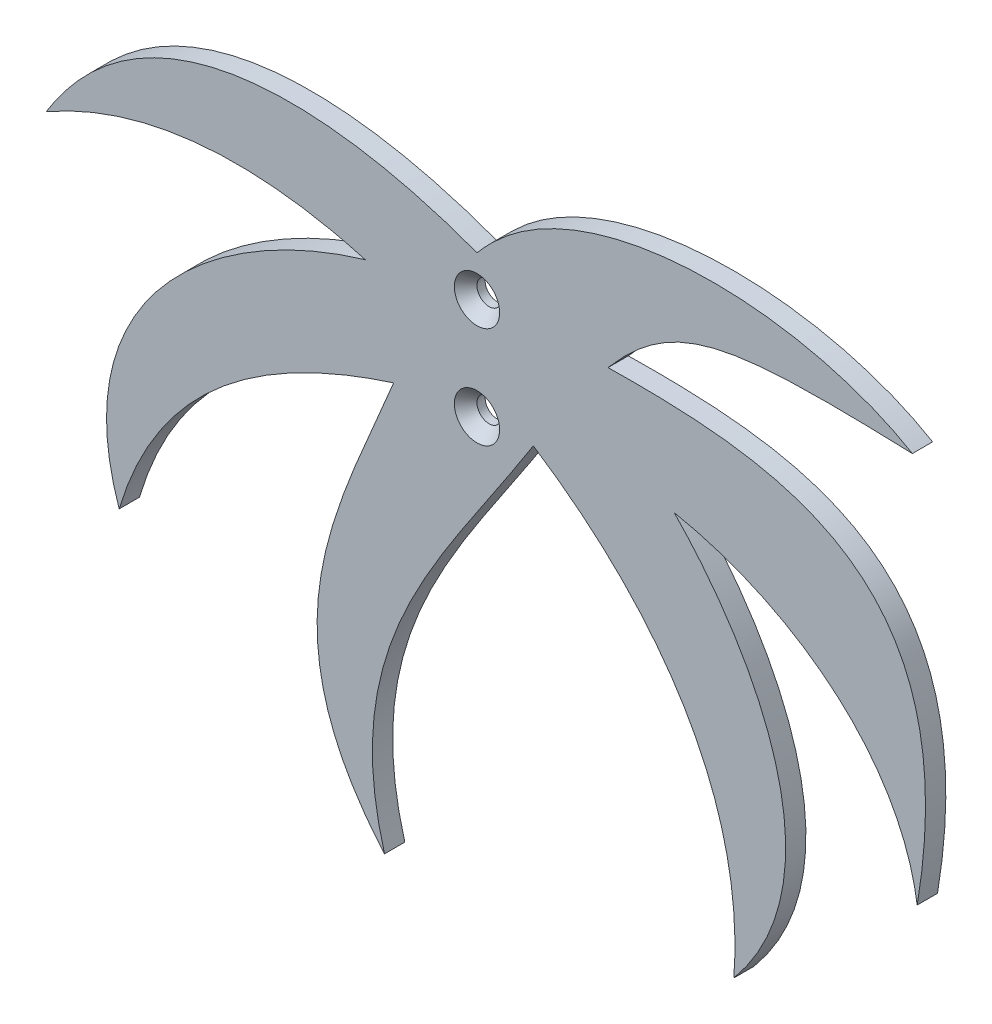
ISO-10303-21;
HEADER;
FILE_DESCRIPTION(('STEP AP214'),'2;1');
FILE_NAME('part.step','',(''),(''),'','','');
FILE_SCHEMA(('AUTOMOTIVE_DESIGN { 1 0 10303 214 1 1 1 1 }'));
ENDSEC;
DATA;
#1=APPLICATION_CONTEXT('core data for automotive mechanical design processes');
#2=APPLICATION_PROTOCOL_DEFINITION('international standard','automotive_design',2000,#1);
#3=PRODUCT_CONTEXT('',#1,'mechanical');
#4=PRODUCT('Part','Part','',(#3));
#5=PRODUCT_RELATED_PRODUCT_CATEGORY('part','',(#4));
#6=PRODUCT_DEFINITION_FORMATION('','',#4);
#7=PRODUCT_DEFINITION_CONTEXT('part definition',#1,'design');
#8=PRODUCT_DEFINITION('design','',#6,#7);
#9=PRODUCT_DEFINITION_SHAPE('','',#8);
#10=(LENGTH_UNIT() NAMED_UNIT(*) SI_UNIT(.MILLI.,.METRE.));
#11=(NAMED_UNIT(*) PLANE_ANGLE_UNIT() SI_UNIT($,.RADIAN.));
#12=(NAMED_UNIT(*) SI_UNIT($,.STERADIAN.) SOLID_ANGLE_UNIT());
#13=UNCERTAINTY_MEASURE_WITH_UNIT(LENGTH_MEASURE(1.E-05),#10,'distance_accuracy_value','');
#14=(GEOMETRIC_REPRESENTATION_CONTEXT(3) GLOBAL_UNCERTAINTY_ASSIGNED_CONTEXT((#13)) GLOBAL_UNIT_ASSIGNED_CONTEXT((#10,
#11,#12)) REPRESENTATION_CONTEXT('',''));
#15=CARTESIAN_POINT('',(0.,0.,0.));
#16=DIRECTION('',(0.,0.,1.));
#17=DIRECTION('',(1.,0.,0.));
#18=AXIS2_PLACEMENT_3D('',#15,#16,#17);
#19=CARTESIAN_POINT('',(34.9318842944097,165.025383651975,3.175));
#20=CARTESIAN_POINT('',(50.935408962238,174.180938827234,3.175));
#21=CARTESIAN_POINT('',(68.3799734184894,174.627254848897,3.175));
#22=CARTESIAN_POINT('',(84.8831580295017,169.92816000068,3.175));
#23=B_SPLINE_CURVE_WITH_KNOTS('',3,(#19,#20,#21,#22),.UNSPECIFIED.,.F.,.F.,(4,4),(0.,
0.348652947278012),.UNSPECIFIED.);
#24=DIRECTION('',(0.,0.,-1.));
#25=VECTOR('',#24,1.);
#26=SURFACE_OF_LINEAR_EXTRUSION('',#23,#25);
#27=CARTESIAN_POINT('',(34.9318842944097,165.025383651975,0.));
#28=CARTESIAN_POINT('',(50.935408962238,174.180938827234,0.));
#29=CARTESIAN_POINT('',(68.3799734184894,174.627254848897,0.));
#30=CARTESIAN_POINT('',(84.8831580295017,169.92816000068,0.));
#31=B_SPLINE_CURVE_WITH_KNOTS('',3,(#27,#28,#29,#30),.UNSPECIFIED.,.F.,.F.,(4,4),(0.,
0.348652947278012),.UNSPECIFIED.);
#32=CARTESIAN_POINT('',(34.9318842944097,165.025383651975,0.));
#33=VERTEX_POINT('',#32);
#34=CARTESIAN_POINT('',(84.8831580295017,169.92816000068,0.));
#35=VERTEX_POINT('',#34);
#36=EDGE_CURVE('E267',#33,#35,#31,.T.);
#37=ORIENTED_EDGE('',*,*,#36,.T.);
#38=DIRECTION('',(0.,0.,-1.));
#39=VECTOR('',#38,1.);
#40=CARTESIAN_POINT('',(84.8831580295017,169.92816000068,3.175));
#41=LINE('',#40,#39);
#42=CARTESIAN_POINT('',(84.8831580295017,169.92816000068,3.175));
#43=VERTEX_POINT('',#42);
#44=EDGE_CURVE('E11',#43,#35,#41,.T.);
#45=ORIENTED_EDGE('',*,*,#44,.F.);
#46=CARTESIAN_POINT('',(34.9318842944097,165.025383651975,3.175));
#47=VERTEX_POINT('',#46);
#48=EDGE_CURVE('E341',#47,#43,#23,.T.);
#49=ORIENTED_EDGE('',*,*,#48,.F.);
#50=DIRECTION('',(0.,0.,-1.));
#51=VECTOR('',#50,1.);
#52=CARTESIAN_POINT('',(34.9318842944097,165.025383651975,3.175));
#53=LINE('',#52,#51);
#54=EDGE_CURVE('E150',#47,#33,#53,.T.);
#55=ORIENTED_EDGE('',*,*,#54,.T.);
#56=EDGE_LOOP('',(#37,#45,#49,#55));
#57=FACE_BOUND('',#56,.T.);
#58=ADVANCED_FACE('F33',(#57),#26,.F.);
#59=CARTESIAN_POINT('',(84.8831580295017,169.92816000068,3.175));
#60=CARTESIAN_POINT('',(82.9281481681476,169.350328203553,3.175));
#61=CARTESIAN_POINT('',(59.9185762656003,161.597817566055,3.175));
#62=CARTESIAN_POINT('',(37.8919334479338,141.396576530359,3.175));
#63=CARTESIAN_POINT('',(46.3484138217359,116.890021040357,3.175));
#64=B_SPLINE_CURVE_WITH_KNOTS('',3,(#59,#60,#61,#62,#63),.UNSPECIFIED.,.F.,.F.,(4,1,4),(0.,
0.0322278870888439,0.380913319405428),.UNSPECIFIED.);
#65=DIRECTION('',(0.,0.,-1.));
#66=VECTOR('',#65,1.);
#67=SURFACE_OF_LINEAR_EXTRUSION('',#64,#66);
#68=CARTESIAN_POINT('',(84.8831580295017,169.92816000068,0.));
#69=CARTESIAN_POINT('',(82.9281481681476,169.350328203553,0.));
#70=CARTESIAN_POINT('',(59.9185762656003,161.597817566055,0.));
#71=CARTESIAN_POINT('',(37.8919334479338,141.396576530359,0.));
#72=CARTESIAN_POINT('',(46.3484138217359,116.890021040357,0.));
#73=B_SPLINE_CURVE_WITH_KNOTS('',3,(#68,#69,#70,#71,#72),.UNSPECIFIED.,.F.,.F.,(4,1,4),(0.,
0.0322278870888439,0.380913319405428),.UNSPECIFIED.);
#74=CARTESIAN_POINT('',(46.3484138217359,116.890021040357,0.));
#75=VERTEX_POINT('',#74);
#76=EDGE_CURVE('E258',#35,#75,#73,.T.);
#77=ORIENTED_EDGE('',*,*,#76,.T.);
#78=DIRECTION('',(0.,0.,-1.));
#79=VECTOR('',#78,1.);
#80=CARTESIAN_POINT('',(46.3484138217359,116.890021040357,3.175));
#81=LINE('',#80,#79);
#82=CARTESIAN_POINT('',(46.3484138217359,116.890021040357,3.175));
#83=VERTEX_POINT('',#82);
#84=EDGE_CURVE('E42',#83,#75,#81,.T.);
#85=ORIENTED_EDGE('',*,*,#84,.F.);
#86=EDGE_CURVE('E105',#43,#83,#64,.T.);
#87=ORIENTED_EDGE('',*,*,#86,.F.);
#88=ORIENTED_EDGE('',*,*,#44,.T.);
#89=EDGE_LOOP('',(#77,#85,#87,#88));
#90=FACE_BOUND('',#89,.T.);
#91=ADVANCED_FACE('F251',(#90),#67,.F.);
#92=CARTESIAN_POINT('',(46.3484138217359,116.890021040357,3.175));
#93=CARTESIAN_POINT('',(52.7963543464873,138.616158390343,3.175));
#94=CARTESIAN_POINT('',(70.0851339369216,149.298268287012,3.175));
#95=CARTESIAN_POINT('',(89.3084992892088,155.455602419083,3.175));
#96=B_SPLINE_CURVE_WITH_KNOTS('',3,(#92,#93,#94,#95),.UNSPECIFIED.,.F.,.F.,(4,4),(0.,
0.378547613733734),.UNSPECIFIED.);
#97=DIRECTION('',(0.,0.,-1.));
#98=VECTOR('',#97,1.);
#99=SURFACE_OF_LINEAR_EXTRUSION('',#96,#98);
#100=CARTESIAN_POINT('',(46.3484138217359,116.890021040357,0.));
#101=CARTESIAN_POINT('',(52.7963543464873,138.616158390343,0.));
#102=CARTESIAN_POINT('',(70.0851339369216,149.298268287012,0.));
#103=CARTESIAN_POINT('',(89.3084992892088,155.455602419083,0.));
#104=B_SPLINE_CURVE_WITH_KNOTS('',3,(#100,#101,#102,#103),.UNSPECIFIED.,.F.,.F.,(4,4),(0.,
0.378547613733734),.UNSPECIFIED.);
#105=CARTESIAN_POINT('',(89.3084992892088,155.455602419083,0.));
#106=VERTEX_POINT('',#105);
#107=EDGE_CURVE('E266',#75,#106,#104,.T.);
#108=ORIENTED_EDGE('',*,*,#107,.T.);
#109=DIRECTION('',(0.,0.,-1.));
#110=VECTOR('',#109,1.);
#111=CARTESIAN_POINT('',(89.3084992892088,155.455602419083,3.175));
#112=LINE('',#111,#110);
#113=CARTESIAN_POINT('',(89.3084992892088,155.455602419083,3.175));
#114=VERTEX_POINT('',#113);
#115=EDGE_CURVE('E271',#114,#106,#112,.T.);
#116=ORIENTED_EDGE('',*,*,#115,.F.);
#117=EDGE_CURVE('E235',#83,#114,#96,.T.);
#118=ORIENTED_EDGE('',*,*,#117,.F.);
#119=ORIENTED_EDGE('',*,*,#84,.T.);
#120=EDGE_LOOP('',(#108,#116,#118,#119));
#121=FACE_BOUND('',#120,.T.);
#122=ADVANCED_FACE('F249',(#121),#99,.F.);
#123=CARTESIAN_POINT('',(89.3084992892088,155.455602419083,3.175));
#124=CARTESIAN_POINT('',(88.8589301375024,154.38608642332,3.175));
#125=CARTESIAN_POINT('',(79.6869249516935,132.536670793102,3.175));
#126=CARTESIAN_POINT('',(69.2849733279046,112.208882094214,3.175));
#127=CARTESIAN_POINT('',(87.8817767994514,90.9030911772362,3.175));
#128=B_SPLINE_CURVE_WITH_KNOTS('',3,(#123,#124,#125,#126,#127),.UNSPECIFIED.,.F.,.F.,(4,1,4),
(0.,0.0198169392244469,0.4048140320126),.UNSPECIFIED.);
#129=DIRECTION('',(0.,0.,-1.));
#130=VECTOR('',#129,1.);
#131=SURFACE_OF_LINEAR_EXTRUSION('',#128,#130);
#132=CARTESIAN_POINT('',(89.3084992892088,155.455602419083,0.));
#133=CARTESIAN_POINT('',(88.8589301375024,154.38608642332,0.));
#134=CARTESIAN_POINT('',(79.6869249516935,132.536670793102,0.));
#135=CARTESIAN_POINT('',(69.2849733279046,112.208882094214,0.));
#136=CARTESIAN_POINT('',(87.8817767994514,90.9030911772362,0.));
#137=B_SPLINE_CURVE_WITH_KNOTS('',3,(#132,#133,#134,#135,#136),.UNSPECIFIED.,.F.,.F.,(4,1,4),
(0.,0.0198169392244469,0.4048140320126),.UNSPECIFIED.);
#138=CARTESIAN_POINT('',(87.8817767994514,90.9030911772362,0.));
#139=VERTEX_POINT('',#138);
#140=EDGE_CURVE('E275',#106,#139,#137,.T.);
#141=ORIENTED_EDGE('',*,*,#140,.T.);
#142=DIRECTION('',(0.,0.,-1.));
#143=VECTOR('',#142,1.);
#144=CARTESIAN_POINT('',(87.8817767994514,90.9030911772362,3.175));
#145=LINE('',#144,#143);
#146=CARTESIAN_POINT('',(87.8817767994514,90.9030911772362,3.175));
#147=VERTEX_POINT('',#146);
#148=EDGE_CURVE('E360',#147,#139,#145,.T.);
#149=ORIENTED_EDGE('',*,*,#148,.F.);
#150=EDGE_CURVE('E227',#114,#147,#128,.T.);
#151=ORIENTED_EDGE('',*,*,#150,.F.);
#152=ORIENTED_EDGE('',*,*,#115,.T.);
#153=EDGE_LOOP('',(#141,#149,#151,#152));
#154=FACE_BOUND('',#153,.T.);
#155=ADVANCED_FACE('F219',(#154),#131,.F.);
#156=CARTESIAN_POINT('',(87.8817767994514,90.9030911772362,3.175));
#157=CARTESIAN_POINT('',(80.7441069976222,115.72973752556,3.175));
#158=CARTESIAN_POINT('',(96.5015498337835,135.001149115594,3.175));
#159=CARTESIAN_POINT('',(109.96743747668,155.985823694331,3.175));
#160=CARTESIAN_POINT('',(111.168977907781,157.85113159438,3.175));
#161=B_SPLINE_CURVE_WITH_KNOTS('',3,(#156,#157,#158,#159,#160),.UNSPECIFIED.,.F.,.F.,(4,1,4),
(0.,0.464688532361584,0.510268862562464),.UNSPECIFIED.);
#162=DIRECTION('',(0.,0.,-1.));
#163=VECTOR('',#162,1.);
#164=SURFACE_OF_LINEAR_EXTRUSION('',#161,#163);
#165=CARTESIAN_POINT('',(87.8817767994514,90.9030911772362,0.));
#166=CARTESIAN_POINT('',(80.7441069976222,115.72973752556,0.));
#167=CARTESIAN_POINT('',(96.5015498337835,135.001149115594,0.));
#168=CARTESIAN_POINT('',(109.96743747668,155.985823694331,0.));
#169=CARTESIAN_POINT('',(111.168977907781,157.85113159438,0.));
#170=B_SPLINE_CURVE_WITH_KNOTS('',3,(#165,#166,#167,#168,#169),.UNSPECIFIED.,.F.,.F.,(4,1,4),
(0.,0.464688532361584,0.510268862562464),.UNSPECIFIED.);
#171=CARTESIAN_POINT('',(111.168977907781,157.85113159438,0.));
#172=VERTEX_POINT('',#171);
#173=EDGE_CURVE('E277',#139,#172,#170,.T.);
#174=ORIENTED_EDGE('',*,*,#173,.T.);
#175=DIRECTION('',(0.,0.,-1.));
#176=VECTOR('',#175,1.);
#177=CARTESIAN_POINT('',(111.168977907781,157.85113159438,3.175));
#178=LINE('',#177,#176);
#179=CARTESIAN_POINT('',(111.168977907781,157.85113159438,3.175));
#180=VERTEX_POINT('',#179);
#181=EDGE_CURVE('E357',#180,#172,#178,.T.);
#182=ORIENTED_EDGE('',*,*,#181,.F.);
#183=EDGE_CURVE('E223',#147,#180,#161,.T.);
#184=ORIENTED_EDGE('',*,*,#183,.F.);
#185=ORIENTED_EDGE('',*,*,#148,.T.);
#186=EDGE_LOOP('',(#174,#182,#184,#185));
#187=FACE_BOUND('',#186,.T.);
#188=ADVANCED_FACE('F215',(#187),#164,.F.);
#189=CARTESIAN_POINT('',(111.168977907781,157.85113159438,3.175));
#190=CARTESIAN_POINT('',(130.281346762747,145.416554664487,3.175));
#191=CARTESIAN_POINT('',(144.49336151199,126.332685465082,3.175));
#192=CARTESIAN_POINT('',(142.542206676724,101.41044169116,3.175));
#193=B_SPLINE_CURVE_WITH_KNOTS('',3,(#189,#190,#191,#192),.UNSPECIFIED.,.F.,.F.,(4,4),
(0.543056125693751,1.),.UNSPECIFIED.);
#194=DIRECTION('',(0.,0.,-1.));
#195=VECTOR('',#194,1.);
#196=SURFACE_OF_LINEAR_EXTRUSION('',#193,#195);
#197=CARTESIAN_POINT('',(111.168977907781,157.85113159438,0.));
#198=CARTESIAN_POINT('',(130.281346762747,145.416554664487,0.));
#199=CARTESIAN_POINT('',(144.49336151199,126.332685465082,0.));
#200=CARTESIAN_POINT('',(142.542206676724,101.41044169116,0.));
#201=B_SPLINE_CURVE_WITH_KNOTS('',3,(#197,#198,#199,#200),.UNSPECIFIED.,.F.,.F.,(4,4),
(0.543056125693751,1.),.UNSPECIFIED.);
#202=CARTESIAN_POINT('',(142.542206676724,101.41044169116,0.));
#203=VERTEX_POINT('',#202);
#204=EDGE_CURVE('E295',#172,#203,#201,.T.);
#205=ORIENTED_EDGE('',*,*,#204,.T.);
#206=DIRECTION('',(0.,0.,-1.));
#207=VECTOR('',#206,1.);
#208=CARTESIAN_POINT('',(142.542206676724,101.41044169116,3.175));
#209=LINE('',#208,#207);
#210=CARTESIAN_POINT('',(142.542206676724,101.41044169116,3.175));
#211=VERTEX_POINT('',#210);
#212=EDGE_CURVE('E354',#211,#203,#209,.T.);
#213=ORIENTED_EDGE('',*,*,#212,.F.);
#214=EDGE_CURVE('E200',#180,#211,#193,.T.);
#215=ORIENTED_EDGE('',*,*,#214,.F.);
#216=ORIENTED_EDGE('',*,*,#181,.T.);
#217=EDGE_LOOP('',(#205,#213,#215,#216));
#218=FACE_BOUND('',#217,.T.);
#219=ADVANCED_FACE('F211',(#218),#196,.F.);
#220=CARTESIAN_POINT('',(142.542206676724,101.41044169116,3.175));
#221=CARTESIAN_POINT('',(156.67726699633,118.334043550568,3.175));
#222=CARTESIAN_POINT('',(149.411618040919,141.491919337554,3.175));
#223=CARTESIAN_POINT('',(135.17110400227,157.821803299469,3.175));
#224=CARTESIAN_POINT('',(133.21124206111,159.831846765792,3.175));
#225=B_SPLINE_CURVE_WITH_KNOTS('',3,(#220,#221,#222,#223,#224),.UNSPECIFIED.,.F.,.F.,(4,1,4),
(0.632989668791927,0.952230696733158,1.),.UNSPECIFIED.);
#226=DIRECTION('',(0.,0.,-1.));
#227=VECTOR('',#226,1.);
#228=SURFACE_OF_LINEAR_EXTRUSION('',#225,#227);
#229=CARTESIAN_POINT('',(142.542206676724,101.41044169116,0.));
#230=CARTESIAN_POINT('',(156.67726699633,118.334043550568,0.));
#231=CARTESIAN_POINT('',(149.411618040919,141.491919337554,0.));
#232=CARTESIAN_POINT('',(135.17110400227,157.821803299469,0.));
#233=CARTESIAN_POINT('',(133.21124206111,159.831846765792,0.));
#234=B_SPLINE_CURVE_WITH_KNOTS('',3,(#229,#230,#231,#232,#233),.UNSPECIFIED.,.F.,.F.,(4,1,4),
(0.632989668791927,0.952230696733158,1.),.UNSPECIFIED.);
#235=CARTESIAN_POINT('',(133.21124206111,159.831846765792,0.));
#236=VERTEX_POINT('',#235);
#237=EDGE_CURVE('E302',#203,#236,#234,.T.);
#238=ORIENTED_EDGE('',*,*,#237,.T.);
#239=DIRECTION('',(0.,0.,-1.));
#240=VECTOR('',#239,1.);
#241=CARTESIAN_POINT('',(133.21124206111,159.831846765792,3.175));
#242=LINE('',#241,#240);
#243=CARTESIAN_POINT('',(133.21124206111,159.831846765792,3.175));
#244=VERTEX_POINT('',#243);
#245=EDGE_CURVE('E351',#244,#236,#242,.T.);
#246=ORIENTED_EDGE('',*,*,#245,.F.);
#247=EDGE_CURVE('E192',#211,#244,#225,.T.);
#248=ORIENTED_EDGE('',*,*,#247,.F.);
#249=ORIENTED_EDGE('',*,*,#212,.T.);
#250=EDGE_LOOP('',(#238,#246,#248,#249));
#251=FACE_BOUND('',#250,.T.);
#252=ADVANCED_FACE('F208',(#251),#228,.F.);
#253=CARTESIAN_POINT('',(133.21124206111,159.831846765792,3.175));
#254=CARTESIAN_POINT('',(133.979472702372,159.682774193718,3.175));
#255=CARTESIAN_POINT('',(151.701954736328,155.882016517411,3.175));
#256=CARTESIAN_POINT('',(168.618692727697,143.562281615761,3.175));
#257=CARTESIAN_POINT('',(171.253334776737,125.653941668683,3.175));
#258=B_SPLINE_CURVE_WITH_KNOTS('',3,(#253,#254,#255,#256,#257),.UNSPECIFIED.,.F.,.F.,(4,1,4),
(0.658818976791305,0.673582964739664,1.),.UNSPECIFIED.);
#259=DIRECTION('',(0.,0.,-1.));
#260=VECTOR('',#259,1.);
#261=SURFACE_OF_LINEAR_EXTRUSION('',#258,#260);
#262=CARTESIAN_POINT('',(133.21124206111,159.831846765792,0.));
#263=CARTESIAN_POINT('',(133.979472702372,159.682774193718,0.));
#264=CARTESIAN_POINT('',(151.701954736328,155.882016517411,0.));
#265=CARTESIAN_POINT('',(168.618692727697,143.562281615761,0.));
#266=CARTESIAN_POINT('',(171.253334776737,125.653941668683,0.));
#267=B_SPLINE_CURVE_WITH_KNOTS('',3,(#262,#263,#264,#265,#266),.UNSPECIFIED.,.F.,.F.,(4,1,4),
(0.658818976791305,0.673582964739664,1.),.UNSPECIFIED.);
#268=CARTESIAN_POINT('',(171.253334776737,125.653941668683,0.));
#269=VERTEX_POINT('',#268);
#270=EDGE_CURVE('E309',#236,#269,#267,.T.);
#271=ORIENTED_EDGE('',*,*,#270,.T.);
#272=DIRECTION('',(0.,0.,-1.));
#273=VECTOR('',#272,1.);
#274=CARTESIAN_POINT('',(171.253334776737,125.653941668683,3.175));
#275=LINE('',#274,#273);
#276=CARTESIAN_POINT('',(171.253334776737,125.653941668683,3.175));
#277=VERTEX_POINT('',#276);
#278=EDGE_CURVE('E348',#277,#269,#275,.T.);
#279=ORIENTED_EDGE('',*,*,#278,.F.);
#280=EDGE_CURVE('E184',#244,#277,#258,.T.);
#281=ORIENTED_EDGE('',*,*,#280,.F.);
#282=ORIENTED_EDGE('',*,*,#245,.T.);
#283=EDGE_LOOP('',(#271,#279,#281,#282));
#284=FACE_BOUND('',#283,.T.);
#285=ADVANCED_FACE('F177',(#284),#261,.F.);
#286=CARTESIAN_POINT('',(171.253334776737,125.653941668683,3.175));
#287=CARTESIAN_POINT('',(179.076532885599,172.11102568905,3.175));
#288=CARTESIAN_POINT('',(150.100917529022,174.691970083943,3.175));
#289=CARTESIAN_POINT('',(122.854505463719,174.304585317595,3.175));
#290=B_SPLINE_CURVE_WITH_KNOTS('',3,(#286,#287,#288,#289),.UNSPECIFIED.,.F.,.F.,(4,4),
(0.582619189101727,1.),.UNSPECIFIED.);
#291=DIRECTION('',(0.,0.,-1.));
#292=VECTOR('',#291,1.);
#293=SURFACE_OF_LINEAR_EXTRUSION('',#290,#292);
#294=CARTESIAN_POINT('',(171.253334776737,125.653941668683,0.));
#295=CARTESIAN_POINT('',(179.076532885599,172.11102568905,0.));
#296=CARTESIAN_POINT('',(150.100917529022,174.691970083943,0.));
#297=CARTESIAN_POINT('',(122.854505463719,174.304585317595,0.));
#298=B_SPLINE_CURVE_WITH_KNOTS('',3,(#294,#295,#296,#297),.UNSPECIFIED.,.F.,.F.,(4,4),
(0.582619189101727,1.),.UNSPECIFIED.);
#299=CARTESIAN_POINT('',(122.854505463719,174.304585317595,0.));
#300=VERTEX_POINT('',#299);
#301=EDGE_CURVE('E316',#269,#300,#298,.T.);
#302=ORIENTED_EDGE('',*,*,#301,.T.);
#303=DIRECTION('',(0.,0.,-1.));
#304=VECTOR('',#303,1.);
#305=CARTESIAN_POINT('',(122.854505463719,174.304585317595,3.175));
#306=LINE('',#305,#304);
#307=CARTESIAN_POINT('',(122.854505463719,174.304585317595,3.175));
#308=VERTEX_POINT('',#307);
#309=EDGE_CURVE('E145',#308,#300,#306,.T.);
#310=ORIENTED_EDGE('',*,*,#309,.F.);
#311=EDGE_CURVE('E136',#277,#308,#290,.T.);
#312=ORIENTED_EDGE('',*,*,#311,.F.);
#313=ORIENTED_EDGE('',*,*,#278,.T.);
#314=EDGE_LOOP('',(#302,#310,#312,#313));
#315=FACE_BOUND('',#314,.T.);
#316=ADVANCED_FACE('F174',(#315),#293,.F.);
#317=CARTESIAN_POINT('',(122.854505463719,174.304585317595,3.175));
#318=CARTESIAN_POINT('',(133.217704907167,186.420887179913,3.175));
#319=CARTESIAN_POINT('',(141.874028439891,187.437840710923,3.175));
#320=CARTESIAN_POINT('',(170.4912547221,186.467930028714,3.175));
#321=B_SPLINE_CURVE_WITH_KNOTS('',3,(#317,#318,#319,#320),.UNSPECIFIED.,.F.,.F.,(4,4),
(0.652055608196373,1.),.UNSPECIFIED.);
#322=DIRECTION('',(0.,0.,-1.));
#323=VECTOR('',#322,1.);
#324=SURFACE_OF_LINEAR_EXTRUSION('',#321,#323);
#325=CARTESIAN_POINT('',(122.854505463719,174.304585317595,0.));
#326=CARTESIAN_POINT('',(133.217704907167,186.420887179913,0.));
#327=CARTESIAN_POINT('',(141.874028439891,187.437840710923,0.));
#328=CARTESIAN_POINT('',(170.4912547221,186.467930028714,0.));
#329=B_SPLINE_CURVE_WITH_KNOTS('',3,(#325,#326,#327,#328),.UNSPECIFIED.,.F.,.F.,(4,4),
(0.652055608196373,1.),.UNSPECIFIED.);
#330=CARTESIAN_POINT('',(170.4912547221,186.467930028714,0.));
#331=VERTEX_POINT('',#330);
#332=EDGE_CURVE('E144',#300,#331,#329,.T.);
#333=ORIENTED_EDGE('',*,*,#332,.T.);
#334=DIRECTION('',(0.,0.,-1.));
#335=VECTOR('',#334,1.);
#336=CARTESIAN_POINT('',(170.4912547221,186.467930028714,3.175));
#337=LINE('',#336,#335);
#338=CARTESIAN_POINT('',(170.4912547221,186.467930028714,3.175));
#339=VERTEX_POINT('',#338);
#340=EDGE_CURVE('E141',#339,#331,#337,.T.);
#341=ORIENTED_EDGE('',*,*,#340,.F.);
#342=EDGE_CURVE('E130',#308,#339,#321,.T.);
#343=ORIENTED_EDGE('',*,*,#342,.F.);
#344=ORIENTED_EDGE('',*,*,#309,.T.);
#345=EDGE_LOOP('',(#333,#341,#343,#344));
#346=FACE_BOUND('',#345,.T.);
#347=ADVANCED_FACE('F142',(#346),#324,.F.);
#348=CARTESIAN_POINT('',(170.4912547221,186.467930028714,3.175));
#349=CARTESIAN_POINT('',(153.725104458016,196.42362773333,3.175));
#350=CARTESIAN_POINT('',(120.085169990225,197.822043176406,3.175));
#351=CARTESIAN_POINT('',(103.688252769155,181.188793447458,3.175));
#352=CARTESIAN_POINT('',(102.354778377948,179.613312561583,3.175));
#353=B_SPLINE_CURVE_WITH_KNOTS('',3,(#348,#349,#350,#351,#352),.UNSPECIFIED.,.F.,.F.,(4,1,4),
(0.566670892019879,0.961897106148961,1.),.UNSPECIFIED.);
#354=DIRECTION('',(0.,0.,-1.));
#355=VECTOR('',#354,1.);
#356=SURFACE_OF_LINEAR_EXTRUSION('',#353,#355);
#357=CARTESIAN_POINT('',(170.4912547221,186.467930028714,0.));
#358=CARTESIAN_POINT('',(153.725104458016,196.42362773333,0.));
#359=CARTESIAN_POINT('',(120.085169990225,197.822043176406,0.));
#360=CARTESIAN_POINT('',(103.688252769155,181.188793447458,0.));
#361=CARTESIAN_POINT('',(102.354778377948,179.613312561583,0.));
#362=B_SPLINE_CURVE_WITH_KNOTS('',3,(#357,#358,#359,#360,#361),.UNSPECIFIED.,.F.,.F.,(4,1,4),
(0.566670892019879,0.961897106148961,1.),.UNSPECIFIED.);
#363=CARTESIAN_POINT('',(102.354778377948,179.613312561583,0.));
#364=VERTEX_POINT('',#363);
#365=EDGE_CURVE('E91',#331,#364,#362,.T.);
#366=ORIENTED_EDGE('',*,*,#365,.T.);
#367=DIRECTION('',(0.,0.,-1.));
#368=VECTOR('',#367,1.);
#369=CARTESIAN_POINT('',(102.354778377948,179.613312561583,3.175));
#370=LINE('',#369,#368);
#371=CARTESIAN_POINT('',(102.354778377948,179.613312561583,3.175));
#372=VERTEX_POINT('',#371);
#373=EDGE_CURVE('E146',#372,#364,#370,.T.);
#374=ORIENTED_EDGE('',*,*,#373,.F.);
#375=EDGE_CURVE('E134',#339,#372,#353,.T.);
#376=ORIENTED_EDGE('',*,*,#375,.F.);
#377=ORIENTED_EDGE('',*,*,#340,.T.);
#378=EDGE_LOOP('',(#366,#374,#376,#377));
#379=FACE_BOUND('',#378,.T.);
#380=ADVANCED_FACE('F148',(#379),#356,.F.);
#381=CARTESIAN_POINT('',(102.354778377948,179.613312561583,3.175));
#382=CARTESIAN_POINT('',(100.44583998078,180.332984416425,3.175));
#383=CARTESIAN_POINT('',(76.4544452103776,188.520066824698,3.175));
#384=CARTESIAN_POINT('',(48.8280550978648,187.719675837498,3.175));
#385=CARTESIAN_POINT('',(34.9318842944097,165.025383651975,3.175));
#386=B_SPLINE_CURVE_WITH_KNOTS('',3,(#381,#382,#383,#384,#385),.UNSPECIFIED.,.F.,.F.,(4,1,4),
(0.,0.0342243230791906,0.423902210945443),.UNSPECIFIED.);
#387=DIRECTION('',(0.,0.,-1.));
#388=VECTOR('',#387,1.);
#389=SURFACE_OF_LINEAR_EXTRUSION('',#386,#388);
#390=CARTESIAN_POINT('',(102.354778377948,179.613312561583,0.));
#391=CARTESIAN_POINT('',(100.44583998078,180.332984416425,0.));
#392=CARTESIAN_POINT('',(76.4544452103776,188.520066824698,0.));
#393=CARTESIAN_POINT('',(48.8280550978648,187.719675837498,0.));
#394=CARTESIAN_POINT('',(34.9318842944097,165.025383651975,0.));
#395=B_SPLINE_CURVE_WITH_KNOTS('',3,(#390,#391,#392,#393,#394),.UNSPECIFIED.,.F.,.F.,(4,1,4),
(0.,0.0342243230791906,0.423902210945443),.UNSPECIFIED.);
#396=EDGE_CURVE('E97',#364,#33,#395,.T.);
#397=ORIENTED_EDGE('',*,*,#396,.T.);
#398=ORIENTED_EDGE('',*,*,#54,.F.);
#399=EDGE_CURVE('E50',#372,#47,#386,.T.);
#400=ORIENTED_EDGE('',*,*,#399,.F.);
#401=ORIENTED_EDGE('',*,*,#373,.T.);
#402=EDGE_LOOP('',(#397,#398,#400,#401));
#403=FACE_BOUND('',#402,.T.);
#404=ADVANCED_FACE('F170',(#403),#389,.F.);
#405=CARTESIAN_POINT('',(59.7201486832617,172.672265585131,3.175));
#406=DIRECTION('',(0.,0.,1.));
#407=DIRECTION('',(1.,0.,0.));
#408=AXIS2_PLACEMENT_3D('',#405,#406,#407);
#409=PLANE('',#408);
#410=CARTESIAN_POINT('',(102.354778377948,173.263312561583,3.175));
#411=DIRECTION('',(0.,0.,1.));
#412=DIRECTION('',(1.,0.,0.));
#413=AXIS2_PLACEMENT_3D('',#410,#411,#412);
#414=CIRCLE('',#413,3.5433);
#415=CARTESIAN_POINT('',(105.898078377948,173.263312561583,3.175));
#416=VERTEX_POINT('',#415);
#417=EDGE_CURVE('E391',#416,#416,#414,.T.);
#418=ORIENTED_EDGE('',*,*,#417,.F.);
#419=EDGE_LOOP('',(#418));
#420=FACE_BOUND('',#419,.T.);
#421=CARTESIAN_POINT('',(102.354778377948,157.388312561583,3.175));
#422=DIRECTION('',(0.,0.,1.));
#423=DIRECTION('',(1.,0.,0.));
#424=AXIS2_PLACEMENT_3D('',#421,#422,#423);
#425=CIRCLE('',#424,3.5433);
#426=CARTESIAN_POINT('',(105.898078377948,157.388312561583,3.175));
#427=VERTEX_POINT('',#426);
#428=EDGE_CURVE('E382',#427,#427,#425,.T.);
#429=ORIENTED_EDGE('',*,*,#428,.F.);
#430=EDGE_LOOP('',(#429));
#431=FACE_BOUND('',#430,.T.);
#432=ORIENTED_EDGE('',*,*,#48,.T.);
#433=ORIENTED_EDGE('',*,*,#86,.T.);
#434=ORIENTED_EDGE('',*,*,#117,.T.);
#435=ORIENTED_EDGE('',*,*,#150,.T.);
#436=ORIENTED_EDGE('',*,*,#183,.T.);
#437=ORIENTED_EDGE('',*,*,#214,.T.);
#438=ORIENTED_EDGE('',*,*,#247,.T.);
#439=ORIENTED_EDGE('',*,*,#280,.T.);
#440=ORIENTED_EDGE('',*,*,#311,.T.);
#441=ORIENTED_EDGE('',*,*,#342,.T.);
#442=ORIENTED_EDGE('',*,*,#375,.T.);
#443=ORIENTED_EDGE('',*,*,#399,.T.);
#444=EDGE_LOOP('',(#432,#433,#434,#435,#436,#437,#438,#439,#440,#441,#442,#443));
#445=FACE_BOUND('',#444,.T.);
#446=ADVANCED_FACE('F132',(#420,#431,#445),#409,.T.);
#447=CARTESIAN_POINT('',(59.7201486832617,172.672265585131,0.));
#448=DIRECTION('',(0.,0.,1.));
#449=DIRECTION('',(1.,0.,0.));
#450=AXIS2_PLACEMENT_3D('',#447,#448,#449);
#451=PLANE('',#450);
#452=CARTESIAN_POINT('',(102.354778377948,173.263312561583,0.));
#453=DIRECTION('',(0.,0.,1.));
#454=DIRECTION('',(1.,0.,0.));
#455=AXIS2_PLACEMENT_3D('',#452,#453,#454);
#456=CIRCLE('',#455,1.89865);
#457=CARTESIAN_POINT('',(104.253428377948,173.263312561583,0.));
#458=VERTEX_POINT('',#457);
#459=EDGE_CURVE('E385',#458,#458,#456,.T.);
#460=ORIENTED_EDGE('',*,*,#459,.T.);
#461=EDGE_LOOP('',(#460));
#462=FACE_BOUND('',#461,.T.);
#463=CARTESIAN_POINT('',(102.354778377948,157.388312561583,0.));
#464=DIRECTION('',(0.,0.,1.));
#465=DIRECTION('',(1.,0.,0.));
#466=AXIS2_PLACEMENT_3D('',#463,#464,#465);
#467=CIRCLE('',#466,1.89865);
#468=CARTESIAN_POINT('',(104.253428377948,157.388312561583,0.));
#469=VERTEX_POINT('',#468);
#470=EDGE_CURVE('E373',#469,#469,#467,.T.);
#471=ORIENTED_EDGE('',*,*,#470,.T.);
#472=EDGE_LOOP('',(#471));
#473=FACE_BOUND('',#472,.T.);
#474=ORIENTED_EDGE('',*,*,#36,.F.);
#475=ORIENTED_EDGE('',*,*,#396,.F.);
#476=ORIENTED_EDGE('',*,*,#365,.F.);
#477=ORIENTED_EDGE('',*,*,#332,.F.);
#478=ORIENTED_EDGE('',*,*,#301,.F.);
#479=ORIENTED_EDGE('',*,*,#270,.F.);
#480=ORIENTED_EDGE('',*,*,#237,.F.);
#481=ORIENTED_EDGE('',*,*,#204,.F.);
#482=ORIENTED_EDGE('',*,*,#173,.F.);
#483=ORIENTED_EDGE('',*,*,#140,.F.);
#484=ORIENTED_EDGE('',*,*,#107,.F.);
#485=ORIENTED_EDGE('',*,*,#76,.F.);
#486=EDGE_LOOP('',(#474,#475,#476,#477,#478,#479,#480,#481,#482,#483,#484,#485));
#487=FACE_BOUND('',#486,.T.);
#488=ADVANCED_FACE('F273',(#462,#473,#487),#451,.F.);
#489=CARTESIAN_POINT('',(102.354778377948,157.388312561583,3.175));
#490=DIRECTION('',(0.,0.,1.));
#491=DIRECTION('',(1.,0.,0.));
#492=AXIS2_PLACEMENT_3D('',#489,#490,#491);
#493=CYLINDRICAL_SURFACE('',#492,1.89864999999999);
#494=ORIENTED_EDGE('',*,*,#470,.F.);
#495=EDGE_LOOP('',(#494));
#496=FACE_BOUND('',#495,.T.);
#497=CARTESIAN_POINT('',(102.354778377948,157.388312561583,1.28304659906396));
#498=DIRECTION('',(0.,0.,1.));
#499=DIRECTION('',(1.,0.,0.));
#500=AXIS2_PLACEMENT_3D('',#497,#498,#499);
#501=CIRCLE('',#500,1.89864999999999);
#502=CARTESIAN_POINT('',(104.253428377948,157.388312561583,1.28304659906396));
#503=VERTEX_POINT('',#502);
#504=EDGE_CURVE('E379',#503,#503,#501,.T.);
#505=ORIENTED_EDGE('',*,*,#504,.T.);
#506=EDGE_LOOP('',(#505));
#507=FACE_BOUND('',#506,.T.);
#508=ADVANCED_FACE('F405',(#496,#507),#493,.F.);
#509=CARTESIAN_POINT('',(102.354778377948,157.388312561583,3.175));
#510=DIRECTION('',(0.,0.,1.));
#511=DIRECTION('',(1.,0.,0.));
#512=AXIS2_PLACEMENT_3D('',#509,#510,#511);
#513=CONICAL_SURFACE('',#512,3.5433,0.715584993317677);
#514=ORIENTED_EDGE('',*,*,#504,.F.);
#515=EDGE_LOOP('',(#514));
#516=FACE_BOUND('',#515,.T.);
#517=ORIENTED_EDGE('',*,*,#428,.T.);
#518=EDGE_LOOP('',(#517));
#519=FACE_BOUND('',#518,.T.);
#520=ADVANCED_FACE('F402',(#516,#519),#513,.F.);
#521=CARTESIAN_POINT('',(102.354778377948,173.263312561583,3.175));
#522=DIRECTION('',(0.,0.,1.));
#523=DIRECTION('',(1.,0.,0.));
#524=AXIS2_PLACEMENT_3D('',#521,#522,#523);
#525=CYLINDRICAL_SURFACE('',#524,1.89864999999999);
#526=ORIENTED_EDGE('',*,*,#459,.F.);
#527=EDGE_LOOP('',(#526));
#528=FACE_BOUND('',#527,.T.);
#529=CARTESIAN_POINT('',(102.354778377948,173.263312561583,1.28304659906396));
#530=DIRECTION('',(0.,0.,1.));
#531=DIRECTION('',(1.,0.,0.));
#532=AXIS2_PLACEMENT_3D('',#529,#530,#531);
#533=CIRCLE('',#532,1.89864999999999);
#534=CARTESIAN_POINT('',(104.253428377948,173.263312561583,1.28304659906396));
#535=VERTEX_POINT('',#534);
#536=EDGE_CURVE('E388',#535,#535,#533,.T.);
#537=ORIENTED_EDGE('',*,*,#536,.T.);
#538=EDGE_LOOP('',(#537));
#539=FACE_BOUND('',#538,.T.);
#540=ADVANCED_FACE('F404',(#528,#539),#525,.F.);
#541=CARTESIAN_POINT('',(102.354778377948,173.263312561583,3.175));
#542=DIRECTION('',(0.,0.,1.));
#543=DIRECTION('',(1.,0.,0.));
#544=AXIS2_PLACEMENT_3D('',#541,#542,#543);
#545=CONICAL_SURFACE('',#544,3.5433,0.715584993317677);
#546=ORIENTED_EDGE('',*,*,#536,.F.);
#547=EDGE_LOOP('',(#546));
#548=FACE_BOUND('',#547,.T.);
#549=ORIENTED_EDGE('',*,*,#417,.T.);
#550=EDGE_LOOP('',(#549));
#551=FACE_BOUND('',#550,.T.);
#552=ADVANCED_FACE('F395',(#548,#551),#545,.F.);
#553=CLOSED_SHELL('',(#58,#91,#122,#155,#188,#219,#252,#285,#316,#347,#380,#404,#446,#488,#508,
#520,#540,#552));
#554=MANIFOLD_SOLID_BREP('B2',#553);
#555=ADVANCED_BREP_SHAPE_REPRESENTATION('',(#18,#554),#14);
#556=SHAPE_DEFINITION_REPRESENTATION(#9,#555);
ENDSEC;
END-ISO-10303-21;
